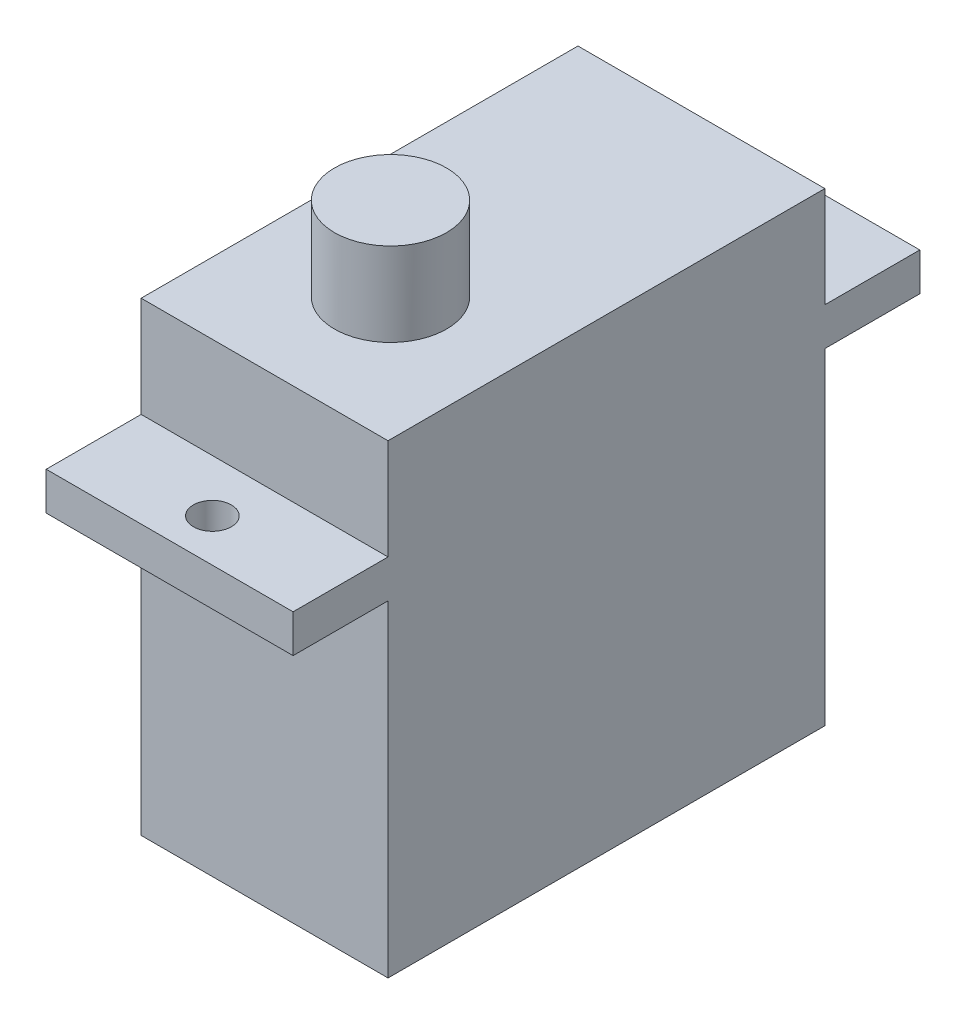
ISO-10303-21;
HEADER;
FILE_DESCRIPTION(('STEP AP214'),'2;1');
FILE_NAME('part.step','',(''),(''),'','','');
FILE_SCHEMA(('AUTOMOTIVE_DESIGN { 1 0 10303 214 1 1 1 1 }'));
ENDSEC;
DATA;
#1=APPLICATION_CONTEXT('core data for automotive mechanical design processes');
#2=APPLICATION_PROTOCOL_DEFINITION('international standard','automotive_design',2000,#1);
#3=PRODUCT_CONTEXT('',#1,'mechanical');
#4=PRODUCT('Part','Part','',(#3));
#5=PRODUCT_RELATED_PRODUCT_CATEGORY('part','',(#4));
#6=PRODUCT_DEFINITION_FORMATION('','',#4);
#7=PRODUCT_DEFINITION_CONTEXT('part definition',#1,'design');
#8=PRODUCT_DEFINITION('design','',#6,#7);
#9=PRODUCT_DEFINITION_SHAPE('','',#8);
#10=(LENGTH_UNIT() NAMED_UNIT(*) SI_UNIT(.MILLI.,.METRE.));
#11=(NAMED_UNIT(*) PLANE_ANGLE_UNIT() SI_UNIT($,.RADIAN.));
#12=(NAMED_UNIT(*) SI_UNIT($,.STERADIAN.) SOLID_ANGLE_UNIT());
#13=UNCERTAINTY_MEASURE_WITH_UNIT(LENGTH_MEASURE(1.E-05),#10,'distance_accuracy_value','');
#14=(GEOMETRIC_REPRESENTATION_CONTEXT(3) GLOBAL_UNCERTAINTY_ASSIGNED_CONTEXT((#13)) GLOBAL_UNIT_ASSIGNED_CONTEXT((#10,
#11,#12)) REPRESENTATION_CONTEXT('',''));
#15=CARTESIAN_POINT('',(0.,0.,0.));
#16=DIRECTION('',(0.,0.,1.));
#17=DIRECTION('',(1.,0.,0.));
#18=AXIS2_PLACEMENT_3D('',#15,#16,#17);
#19=CARTESIAN_POINT('',(13.,8.6,-11.5));
#20=DIRECTION('',(0.,0.,1.));
#21=DIRECTION('',(0.,-1.,0.));
#22=AXIS2_PLACEMENT_3D('',#19,#20,#21);
#23=PLANE('',#22);
#24=DIRECTION('',(0.,1.,0.));
#25=VECTOR('',#24,1.);
#26=CARTESIAN_POINT('',(0.,8.6,-11.5));
#27=LINE('',#26,#25);
#28=CARTESIAN_POINT('',(0.,-8.6,-11.5));
#29=VERTEX_POINT('',#28);
#30=CARTESIAN_POINT('',(0.,8.6,-11.5));
#31=VERTEX_POINT('',#30);
#32=EDGE_CURVE('E165',#29,#31,#27,.T.);
#33=ORIENTED_EDGE('',*,*,#32,.T.);
#34=DIRECTION('',(-1.,0.,0.));
#35=VECTOR('',#34,1.);
#36=CARTESIAN_POINT('',(13.,8.6,-11.5));
#37=LINE('',#36,#35);
#38=CARTESIAN_POINT('',(13.,8.6,-11.5));
#39=VERTEX_POINT('',#38);
#40=EDGE_CURVE('E48',#39,#31,#37,.T.);
#41=ORIENTED_EDGE('',*,*,#40,.F.);
#42=DIRECTION('',(0.,1.,0.));
#43=VECTOR('',#42,1.);
#44=CARTESIAN_POINT('',(13.,8.6,-11.5));
#45=LINE('',#44,#43);
#46=CARTESIAN_POINT('',(13.,-8.6,-11.5));
#47=VERTEX_POINT('',#46);
#48=EDGE_CURVE('E200',#47,#39,#45,.T.);
#49=ORIENTED_EDGE('',*,*,#48,.F.);
#50=DIRECTION('',(-1.,0.,0.));
#51=VECTOR('',#50,1.);
#52=CARTESIAN_POINT('',(13.,-8.6,-11.5));
#53=LINE('',#52,#51);
#54=EDGE_CURVE('E161',#47,#29,#53,.T.);
#55=ORIENTED_EDGE('',*,*,#54,.T.);
#56=EDGE_LOOP('',(#33,#41,#49,#55));
#57=FACE_BOUND('',#56,.T.);
#58=ADVANCED_FACE('F39',(#57),#23,.F.);
#59=CARTESIAN_POINT('',(13.,8.6,-11.5));
#60=DIRECTION('',(0.,1.,0.));
#61=DIRECTION('',(0.,0.,1.));
#62=AXIS2_PLACEMENT_3D('',#59,#60,#61);
#63=PLANE('',#62);
#64=CARTESIAN_POINT('',(6.5,8.6,-14.25));
#65=DIRECTION('',(0.,1.,0.));
#66=DIRECTION('',(0.,0.,1.));
#67=AXIS2_PLACEMENT_3D('',#64,#65,#66);
#68=CIRCLE('',#67,1.);
#69=CARTESIAN_POINT('',(6.5,8.6,-13.25));
#70=VERTEX_POINT('',#69);
#71=EDGE_CURVE('E170',#70,#70,#68,.T.);
#72=ORIENTED_EDGE('',*,*,#71,.T.);
#73=EDGE_LOOP('',(#72));
#74=FACE_BOUND('',#73,.T.);
#75=DIRECTION('',(0.,0.,-1.));
#76=VECTOR('',#75,1.);
#77=CARTESIAN_POINT('',(0.,8.6,-11.5));
#78=LINE('',#77,#76);
#79=CARTESIAN_POINT('',(0.,8.6,-16.5));
#80=VERTEX_POINT('',#79);
#81=EDGE_CURVE('E169',#31,#80,#78,.T.);
#82=ORIENTED_EDGE('',*,*,#81,.T.);
#83=DIRECTION('',(-1.,0.,0.));
#84=VECTOR('',#83,1.);
#85=CARTESIAN_POINT('',(13.,8.6,-16.5));
#86=LINE('',#85,#84);
#87=CARTESIAN_POINT('',(13.,8.6,-16.5));
#88=VERTEX_POINT('',#87);
#89=EDGE_CURVE('E231',#88,#80,#86,.T.);
#90=ORIENTED_EDGE('',*,*,#89,.F.);
#91=DIRECTION('',(0.,0.,-1.));
#92=VECTOR('',#91,1.);
#93=CARTESIAN_POINT('',(13.,8.6,-11.5));
#94=LINE('',#93,#92);
#95=EDGE_CURVE('E112',#39,#88,#94,.T.);
#96=ORIENTED_EDGE('',*,*,#95,.F.);
#97=ORIENTED_EDGE('',*,*,#40,.T.);
#98=EDGE_LOOP('',(#82,#90,#96,#97));
#99=FACE_BOUND('',#98,.T.);
#100=ADVANCED_FACE('F307',(#74,#99),#63,.F.);
#101=CARTESIAN_POINT('',(13.,10.6,-16.5));
#102=DIRECTION('',(0.,0.,1.));
#103=DIRECTION('',(1.,0.,0.));
#104=AXIS2_PLACEMENT_3D('',#101,#102,#103);
#105=PLANE('',#104);
#106=DIRECTION('',(0.,1.,0.));
#107=VECTOR('',#106,1.);
#108=CARTESIAN_POINT('',(0.,10.6,-16.5));
#109=LINE('',#108,#107);
#110=CARTESIAN_POINT('',(0.,10.6,-16.5));
#111=VERTEX_POINT('',#110);
#112=EDGE_CURVE('E173',#80,#111,#109,.T.);
#113=ORIENTED_EDGE('',*,*,#112,.T.);
#114=DIRECTION('',(-1.,0.,0.));
#115=VECTOR('',#114,1.);
#116=CARTESIAN_POINT('',(13.,10.6,-16.5));
#117=LINE('',#116,#115);
#118=CARTESIAN_POINT('',(13.,10.6,-16.5));
#119=VERTEX_POINT('',#118);
#120=EDGE_CURVE('E227',#119,#111,#117,.T.);
#121=ORIENTED_EDGE('',*,*,#120,.F.);
#122=DIRECTION('',(0.,1.,0.));
#123=VECTOR('',#122,1.);
#124=CARTESIAN_POINT('',(13.,10.6,-16.5));
#125=LINE('',#124,#123);
#126=EDGE_CURVE('E261',#88,#119,#125,.T.);
#127=ORIENTED_EDGE('',*,*,#126,.F.);
#128=ORIENTED_EDGE('',*,*,#89,.T.);
#129=EDGE_LOOP('',(#113,#121,#127,#128));
#130=FACE_BOUND('',#129,.T.);
#131=ADVANCED_FACE('F311',(#130),#105,.F.);
#132=CARTESIAN_POINT('',(13.,10.6,-11.5));
#133=DIRECTION('',(0.,-1.,0.));
#134=DIRECTION('',(0.,0.,-1.));
#135=AXIS2_PLACEMENT_3D('',#132,#133,#134);
#136=PLANE('',#135);
#137=CARTESIAN_POINT('',(6.5,10.6,-14.25));
#138=DIRECTION('',(0.,1.,0.));
#139=DIRECTION('',(0.,0.,1.));
#140=AXIS2_PLACEMENT_3D('',#137,#138,#139);
#141=CIRCLE('',#140,1.);
#142=CARTESIAN_POINT('',(6.5,10.6,-13.25));
#143=VERTEX_POINT('',#142);
#144=EDGE_CURVE('E239',#143,#143,#141,.T.);
#145=ORIENTED_EDGE('',*,*,#144,.F.);
#146=EDGE_LOOP('',(#145));
#147=FACE_BOUND('',#146,.T.);
#148=DIRECTION('',(0.,0.,1.));
#149=VECTOR('',#148,1.);
#150=CARTESIAN_POINT('',(0.,10.6,-11.5));
#151=LINE('',#150,#149);
#152=CARTESIAN_POINT('',(0.,10.6,-11.5));
#153=VERTEX_POINT('',#152);
#154=EDGE_CURVE('E176',#111,#153,#151,.T.);
#155=ORIENTED_EDGE('',*,*,#154,.T.);
#156=DIRECTION('',(-1.,0.,0.));
#157=VECTOR('',#156,1.);
#158=CARTESIAN_POINT('',(13.,10.6,-11.5));
#159=LINE('',#158,#157);
#160=CARTESIAN_POINT('',(13.,10.6,-11.5));
#161=VERTEX_POINT('',#160);
#162=EDGE_CURVE('E223',#161,#153,#159,.T.);
#163=ORIENTED_EDGE('',*,*,#162,.F.);
#164=DIRECTION('',(0.,0.,1.));
#165=VECTOR('',#164,1.);
#166=CARTESIAN_POINT('',(13.,10.6,-11.5));
#167=LINE('',#166,#165);
#168=EDGE_CURVE('E264',#119,#161,#167,.T.);
#169=ORIENTED_EDGE('',*,*,#168,.F.);
#170=ORIENTED_EDGE('',*,*,#120,.T.);
#171=EDGE_LOOP('',(#155,#163,#169,#170));
#172=FACE_BOUND('',#171,.T.);
#173=ADVANCED_FACE('F316',(#147,#172),#136,.F.);
#174=CARTESIAN_POINT('',(13.,15.9,-11.5));
#175=DIRECTION('',(0.,0.,1.));
#176=DIRECTION('',(0.,-1.,0.));
#177=AXIS2_PLACEMENT_3D('',#174,#175,#176);
#178=PLANE('',#177);
#179=DIRECTION('',(0.,1.,0.));
#180=VECTOR('',#179,1.);
#181=CARTESIAN_POINT('',(0.,15.9,-11.5));
#182=LINE('',#181,#180);
#183=CARTESIAN_POINT('',(0.,15.9,-11.5));
#184=VERTEX_POINT('',#183);
#185=EDGE_CURVE('E179',#153,#184,#182,.T.);
#186=ORIENTED_EDGE('',*,*,#185,.T.);
#187=DIRECTION('',(-1.,0.,0.));
#188=VECTOR('',#187,1.);
#189=CARTESIAN_POINT('',(13.,15.9,-11.5));
#190=LINE('',#189,#188);
#191=CARTESIAN_POINT('',(13.,15.9,-11.5));
#192=VERTEX_POINT('',#191);
#193=EDGE_CURVE('E219',#192,#184,#190,.T.);
#194=ORIENTED_EDGE('',*,*,#193,.F.);
#195=DIRECTION('',(0.,1.,0.));
#196=VECTOR('',#195,1.);
#197=CARTESIAN_POINT('',(13.,15.9,-11.5));
#198=LINE('',#197,#196);
#199=EDGE_CURVE('E267',#161,#192,#198,.T.);
#200=ORIENTED_EDGE('',*,*,#199,.F.);
#201=ORIENTED_EDGE('',*,*,#162,.T.);
#202=EDGE_LOOP('',(#186,#194,#200,#201));
#203=FACE_BOUND('',#202,.T.);
#204=ADVANCED_FACE('F322',(#203),#178,.F.);
#205=CARTESIAN_POINT('',(13.,15.9,11.5));
#206=DIRECTION('',(0.,-1.,0.));
#207=DIRECTION('',(0.,0.,-1.));
#208=AXIS2_PLACEMENT_3D('',#205,#206,#207);
#209=PLANE('',#208);
#210=CARTESIAN_POINT('',(6.5,15.9,4.87));
#211=DIRECTION('',(0.,-1.,0.));
#212=DIRECTION('',(0.,0.,-1.));
#213=AXIS2_PLACEMENT_3D('',#210,#211,#212);
#214=CIRCLE('',#213,2.95);
#215=CARTESIAN_POINT('',(6.5,15.9,1.92));
#216=VERTEX_POINT('',#215);
#217=EDGE_CURVE('E11',#216,#216,#214,.F.);
#218=ORIENTED_EDGE('',*,*,#217,.F.);
#219=EDGE_LOOP('',(#218));
#220=FACE_BOUND('',#219,.T.);
#221=DIRECTION('',(0.,0.,1.));
#222=VECTOR('',#221,1.);
#223=CARTESIAN_POINT('',(0.,15.9,11.5));
#224=LINE('',#223,#222);
#225=CARTESIAN_POINT('',(0.,15.9,11.5));
#226=VERTEX_POINT('',#225);
#227=EDGE_CURVE('E182',#184,#226,#224,.T.);
#228=ORIENTED_EDGE('',*,*,#227,.T.);
#229=DIRECTION('',(-1.,0.,0.));
#230=VECTOR('',#229,1.);
#231=CARTESIAN_POINT('',(13.,15.9,11.5));
#232=LINE('',#231,#230);
#233=CARTESIAN_POINT('',(13.,15.9,11.5));
#234=VERTEX_POINT('',#233);
#235=EDGE_CURVE('E215',#234,#226,#232,.T.);
#236=ORIENTED_EDGE('',*,*,#235,.F.);
#237=DIRECTION('',(0.,0.,1.));
#238=VECTOR('',#237,1.);
#239=CARTESIAN_POINT('',(13.,15.9,11.5));
#240=LINE('',#239,#238);
#241=EDGE_CURVE('E270',#192,#234,#240,.T.);
#242=ORIENTED_EDGE('',*,*,#241,.F.);
#243=ORIENTED_EDGE('',*,*,#193,.T.);
#244=EDGE_LOOP('',(#228,#236,#242,#243));
#245=FACE_BOUND('',#244,.T.);
#246=ADVANCED_FACE('F326',(#220,#245),#209,.F.);
#247=CARTESIAN_POINT('',(13.,15.9,11.5));
#248=DIRECTION('',(0.,0.,-1.));
#249=DIRECTION('',(0.,1.,0.));
#250=AXIS2_PLACEMENT_3D('',#247,#248,#249);
#251=PLANE('',#250);
#252=DIRECTION('',(0.,-1.,0.));
#253=VECTOR('',#252,1.);
#254=CARTESIAN_POINT('',(0.,15.9,11.5));
#255=LINE('',#254,#253);
#256=CARTESIAN_POINT('',(0.,10.6,11.5));
#257=VERTEX_POINT('',#256);
#258=EDGE_CURVE('E185',#226,#257,#255,.T.);
#259=ORIENTED_EDGE('',*,*,#258,.T.);
#260=DIRECTION('',(-1.,0.,0.));
#261=VECTOR('',#260,1.);
#262=CARTESIAN_POINT('',(13.,10.6,11.5));
#263=LINE('',#262,#261);
#264=CARTESIAN_POINT('',(13.,10.6,11.5));
#265=VERTEX_POINT('',#264);
#266=EDGE_CURVE('E211',#265,#257,#263,.T.);
#267=ORIENTED_EDGE('',*,*,#266,.F.);
#268=DIRECTION('',(0.,-1.,0.));
#269=VECTOR('',#268,1.);
#270=CARTESIAN_POINT('',(13.,15.9,11.5));
#271=LINE('',#270,#269);
#272=EDGE_CURVE('E273',#234,#265,#271,.T.);
#273=ORIENTED_EDGE('',*,*,#272,.F.);
#274=ORIENTED_EDGE('',*,*,#235,.T.);
#275=EDGE_LOOP('',(#259,#267,#273,#274));
#276=FACE_BOUND('',#275,.T.);
#277=ADVANCED_FACE('F330',(#276),#251,.F.);
#278=CARTESIAN_POINT('',(13.,10.6,16.5));
#279=DIRECTION('',(0.,-1.,0.));
#280=DIRECTION('',(0.,0.,-1.));
#281=AXIS2_PLACEMENT_3D('',#278,#279,#280);
#282=PLANE('',#281);
#283=CARTESIAN_POINT('',(6.5,10.6,14.25));
#284=DIRECTION('',(0.,1.,0.));
#285=DIRECTION('',(0.,0.,1.));
#286=AXIS2_PLACEMENT_3D('',#283,#284,#285);
#287=CIRCLE('',#286,1.);
#288=CARTESIAN_POINT('',(6.5,10.6,15.25));
#289=VERTEX_POINT('',#288);
#290=EDGE_CURVE('E247',#289,#289,#287,.T.);
#291=ORIENTED_EDGE('',*,*,#290,.F.);
#292=EDGE_LOOP('',(#291));
#293=FACE_BOUND('',#292,.T.);
#294=DIRECTION('',(0.,0.,1.));
#295=VECTOR('',#294,1.);
#296=CARTESIAN_POINT('',(0.,10.6,16.5));
#297=LINE('',#296,#295);
#298=CARTESIAN_POINT('',(0.,10.6,16.5));
#299=VERTEX_POINT('',#298);
#300=EDGE_CURVE('E188',#257,#299,#297,.T.);
#301=ORIENTED_EDGE('',*,*,#300,.T.);
#302=DIRECTION('',(-1.,0.,0.));
#303=VECTOR('',#302,1.);
#304=CARTESIAN_POINT('',(13.,10.6,16.5));
#305=LINE('',#304,#303);
#306=CARTESIAN_POINT('',(13.,10.6,16.5));
#307=VERTEX_POINT('',#306);
#308=EDGE_CURVE('E207',#307,#299,#305,.T.);
#309=ORIENTED_EDGE('',*,*,#308,.F.);
#310=DIRECTION('',(0.,0.,1.));
#311=VECTOR('',#310,1.);
#312=CARTESIAN_POINT('',(13.,10.6,16.5));
#313=LINE('',#312,#311);
#314=EDGE_CURVE('E276',#265,#307,#313,.T.);
#315=ORIENTED_EDGE('',*,*,#314,.F.);
#316=ORIENTED_EDGE('',*,*,#266,.T.);
#317=EDGE_LOOP('',(#301,#309,#315,#316));
#318=FACE_BOUND('',#317,.T.);
#319=ADVANCED_FACE('F284',(#293,#318),#282,.F.);
#320=CARTESIAN_POINT('',(13.,10.6,16.5));
#321=DIRECTION('',(0.,0.,-1.));
#322=DIRECTION('',(-1.,0.,0.));
#323=AXIS2_PLACEMENT_3D('',#320,#321,#322);
#324=PLANE('',#323);
#325=DIRECTION('',(0.,-1.,0.));
#326=VECTOR('',#325,1.);
#327=CARTESIAN_POINT('',(0.,10.6,16.5));
#328=LINE('',#327,#326);
#329=CARTESIAN_POINT('',(0.,8.6,16.5));
#330=VERTEX_POINT('',#329);
#331=EDGE_CURVE('E191',#299,#330,#328,.T.);
#332=ORIENTED_EDGE('',*,*,#331,.T.);
#333=DIRECTION('',(-1.,0.,0.));
#334=VECTOR('',#333,1.);
#335=CARTESIAN_POINT('',(13.,8.6,16.5));
#336=LINE('',#335,#334);
#337=CARTESIAN_POINT('',(13.,8.6,16.5));
#338=VERTEX_POINT('',#337);
#339=EDGE_CURVE('E154',#338,#330,#336,.T.);
#340=ORIENTED_EDGE('',*,*,#339,.F.);
#341=DIRECTION('',(0.,-1.,0.));
#342=VECTOR('',#341,1.);
#343=CARTESIAN_POINT('',(13.,10.6,16.5));
#344=LINE('',#343,#342);
#345=EDGE_CURVE('E143',#307,#338,#344,.T.);
#346=ORIENTED_EDGE('',*,*,#345,.F.);
#347=ORIENTED_EDGE('',*,*,#308,.T.);
#348=EDGE_LOOP('',(#332,#340,#346,#347));
#349=FACE_BOUND('',#348,.T.);
#350=ADVANCED_FACE('F288',(#349),#324,.F.);
#351=CARTESIAN_POINT('',(13.,8.6,16.5));
#352=DIRECTION('',(0.,1.,0.));
#353=DIRECTION('',(0.,0.,1.));
#354=AXIS2_PLACEMENT_3D('',#351,#352,#353);
#355=PLANE('',#354);
#356=CARTESIAN_POINT('',(6.5,8.6,14.25));
#357=DIRECTION('',(0.,1.,0.));
#358=DIRECTION('',(0.,0.,1.));
#359=AXIS2_PLACEMENT_3D('',#356,#357,#358);
#360=CIRCLE('',#359,1.);
#361=CARTESIAN_POINT('',(6.5,8.6,15.25));
#362=VERTEX_POINT('',#361);
#363=EDGE_CURVE('E236',#362,#362,#360,.T.);
#364=ORIENTED_EDGE('',*,*,#363,.T.);
#365=EDGE_LOOP('',(#364));
#366=FACE_BOUND('',#365,.T.);
#367=DIRECTION('',(0.,0.,-1.));
#368=VECTOR('',#367,1.);
#369=CARTESIAN_POINT('',(0.,8.6,16.5));
#370=LINE('',#369,#368);
#371=CARTESIAN_POINT('',(0.,8.6,11.5));
#372=VERTEX_POINT('',#371);
#373=EDGE_CURVE('E152',#330,#372,#370,.T.);
#374=ORIENTED_EDGE('',*,*,#373,.T.);
#375=DIRECTION('',(-1.,0.,0.));
#376=VECTOR('',#375,1.);
#377=CARTESIAN_POINT('',(13.,8.6,11.5));
#378=LINE('',#377,#376);
#379=CARTESIAN_POINT('',(13.,8.6,11.5));
#380=VERTEX_POINT('',#379);
#381=EDGE_CURVE('E149',#380,#372,#378,.T.);
#382=ORIENTED_EDGE('',*,*,#381,.F.);
#383=DIRECTION('',(0.,0.,-1.));
#384=VECTOR('',#383,1.);
#385=CARTESIAN_POINT('',(13.,8.6,16.5));
#386=LINE('',#385,#384);
#387=EDGE_CURVE('E137',#338,#380,#386,.T.);
#388=ORIENTED_EDGE('',*,*,#387,.F.);
#389=ORIENTED_EDGE('',*,*,#339,.T.);
#390=EDGE_LOOP('',(#374,#382,#388,#389));
#391=FACE_BOUND('',#390,.T.);
#392=ADVANCED_FACE('F150',(#366,#391),#355,.F.);
#393=CARTESIAN_POINT('',(13.,8.6,11.5));
#394=DIRECTION('',(0.,0.,-1.));
#395=DIRECTION('',(0.,1.,0.));
#396=AXIS2_PLACEMENT_3D('',#393,#394,#395);
#397=PLANE('',#396);
#398=DIRECTION('',(0.,-1.,0.));
#399=VECTOR('',#398,1.);
#400=CARTESIAN_POINT('',(0.,8.6,11.5));
#401=LINE('',#400,#399);
#402=CARTESIAN_POINT('',(0.,-8.6,11.5));
#403=VERTEX_POINT('',#402);
#404=EDGE_CURVE('E97',#372,#403,#401,.T.);
#405=ORIENTED_EDGE('',*,*,#404,.T.);
#406=DIRECTION('',(-1.,0.,0.));
#407=VECTOR('',#406,1.);
#408=CARTESIAN_POINT('',(13.,-8.6,11.5));
#409=LINE('',#408,#407);
#410=CARTESIAN_POINT('',(13.,-8.6,11.5));
#411=VERTEX_POINT('',#410);
#412=EDGE_CURVE('E155',#411,#403,#409,.T.);
#413=ORIENTED_EDGE('',*,*,#412,.F.);
#414=DIRECTION('',(0.,-1.,0.));
#415=VECTOR('',#414,1.);
#416=CARTESIAN_POINT('',(13.,8.6,11.5));
#417=LINE('',#416,#415);
#418=EDGE_CURVE('E141',#380,#411,#417,.T.);
#419=ORIENTED_EDGE('',*,*,#418,.F.);
#420=ORIENTED_EDGE('',*,*,#381,.T.);
#421=EDGE_LOOP('',(#405,#413,#419,#420));
#422=FACE_BOUND('',#421,.T.);
#423=ADVANCED_FACE('F157',(#422),#397,.F.);
#424=CARTESIAN_POINT('',(13.,-8.6,11.5));
#425=DIRECTION('',(0.,1.,0.));
#426=DIRECTION('',(0.,0.,1.));
#427=AXIS2_PLACEMENT_3D('',#424,#425,#426);
#428=PLANE('',#427);
#429=DIRECTION('',(0.,0.,-1.));
#430=VECTOR('',#429,1.);
#431=CARTESIAN_POINT('',(0.,-8.6,11.5));
#432=LINE('',#431,#430);
#433=EDGE_CURVE('E103',#403,#29,#432,.T.);
#434=ORIENTED_EDGE('',*,*,#433,.T.);
#435=ORIENTED_EDGE('',*,*,#54,.F.);
#436=DIRECTION('',(0.,0.,-1.));
#437=VECTOR('',#436,1.);
#438=CARTESIAN_POINT('',(13.,-8.6,11.5));
#439=LINE('',#438,#437);
#440=EDGE_CURVE('E56',#411,#47,#439,.T.);
#441=ORIENTED_EDGE('',*,*,#440,.F.);
#442=ORIENTED_EDGE('',*,*,#412,.T.);
#443=EDGE_LOOP('',(#434,#435,#441,#442));
#444=FACE_BOUND('',#443,.T.);
#445=ADVANCED_FACE('F296',(#444),#428,.F.);
#446=CARTESIAN_POINT('',(13.,0.,0.));
#447=DIRECTION('',(1.,0.,0.));
#448=DIRECTION('',(0.,0.,-1.));
#449=AXIS2_PLACEMENT_3D('',#446,#447,#448);
#450=PLANE('',#449);
#451=ORIENTED_EDGE('',*,*,#48,.T.);
#452=ORIENTED_EDGE('',*,*,#95,.T.);
#453=ORIENTED_EDGE('',*,*,#126,.T.);
#454=ORIENTED_EDGE('',*,*,#168,.T.);
#455=ORIENTED_EDGE('',*,*,#199,.T.);
#456=ORIENTED_EDGE('',*,*,#241,.T.);
#457=ORIENTED_EDGE('',*,*,#272,.T.);
#458=ORIENTED_EDGE('',*,*,#314,.T.);
#459=ORIENTED_EDGE('',*,*,#345,.T.);
#460=ORIENTED_EDGE('',*,*,#387,.T.);
#461=ORIENTED_EDGE('',*,*,#418,.T.);
#462=ORIENTED_EDGE('',*,*,#440,.T.);
#463=EDGE_LOOP('',(#451,#452,#453,#454,#455,#456,#457,#458,#459,#460,#461,#462));
#464=FACE_BOUND('',#463,.T.);
#465=ADVANCED_FACE('F139',(#464),#450,.T.);
#466=CARTESIAN_POINT('',(0.,0.,0.));
#467=DIRECTION('',(1.,0.,0.));
#468=DIRECTION('',(0.,0.,-1.));
#469=AXIS2_PLACEMENT_3D('',#466,#467,#468);
#470=PLANE('',#469);
#471=ORIENTED_EDGE('',*,*,#32,.F.);
#472=ORIENTED_EDGE('',*,*,#433,.F.);
#473=ORIENTED_EDGE('',*,*,#404,.F.);
#474=ORIENTED_EDGE('',*,*,#373,.F.);
#475=ORIENTED_EDGE('',*,*,#331,.F.);
#476=ORIENTED_EDGE('',*,*,#300,.F.);
#477=ORIENTED_EDGE('',*,*,#258,.F.);
#478=ORIENTED_EDGE('',*,*,#227,.F.);
#479=ORIENTED_EDGE('',*,*,#185,.F.);
#480=ORIENTED_EDGE('',*,*,#154,.F.);
#481=ORIENTED_EDGE('',*,*,#112,.F.);
#482=ORIENTED_EDGE('',*,*,#81,.F.);
#483=EDGE_LOOP('',(#471,#472,#473,#474,#475,#476,#477,#478,#479,#480,#481,#482));
#484=FACE_BOUND('',#483,.T.);
#485=ADVANCED_FACE('F291',(#484),#470,.F.);
#486=CARTESIAN_POINT('',(6.5,-8.6,14.25));
#487=DIRECTION('',(0.,1.,0.));
#488=DIRECTION('',(0.,0.,1.));
#489=AXIS2_PLACEMENT_3D('',#486,#487,#488);
#490=CYLINDRICAL_SURFACE('',#489,1.);
#491=ORIENTED_EDGE('',*,*,#290,.T.);
#492=EDGE_LOOP('',(#491));
#493=FACE_BOUND('',#492,.T.);
#494=ORIENTED_EDGE('',*,*,#363,.F.);
#495=EDGE_LOOP('',(#494));
#496=FACE_BOUND('',#495,.T.);
#497=ADVANCED_FACE('F372',(#493,#496),#490,.F.);
#498=CARTESIAN_POINT('',(6.5,-8.6,-14.25));
#499=DIRECTION('',(0.,1.,0.));
#500=DIRECTION('',(0.,0.,1.));
#501=AXIS2_PLACEMENT_3D('',#498,#499,#500);
#502=CYLINDRICAL_SURFACE('',#501,1.);
#503=ORIENTED_EDGE('',*,*,#144,.T.);
#504=EDGE_LOOP('',(#503));
#505=FACE_BOUND('',#504,.T.);
#506=ORIENTED_EDGE('',*,*,#71,.F.);
#507=EDGE_LOOP('',(#506));
#508=FACE_BOUND('',#507,.T.);
#509=ADVANCED_FACE('F422',(#505,#508),#502,.F.);
#510=CARTESIAN_POINT('',(6.5,20.3,4.87));
#511=DIRECTION('',(0.,-1.,0.));
#512=DIRECTION('',(0.,0.,-1.));
#513=AXIS2_PLACEMENT_3D('',#510,#511,#512);
#514=CYLINDRICAL_SURFACE('',#513,2.95);
#515=CARTESIAN_POINT('',(6.5,20.3,4.87));
#516=DIRECTION('',(0.,1.,0.));
#517=DIRECTION('',(0.,0.,1.));
#518=AXIS2_PLACEMENT_3D('',#515,#516,#517);
#519=CIRCLE('',#518,2.95);
#520=CARTESIAN_POINT('',(6.5,20.3,7.82));
#521=VERTEX_POINT('',#520);
#522=EDGE_CURVE('E253',#521,#521,#519,.T.);
#523=ORIENTED_EDGE('',*,*,#522,.F.);
#524=EDGE_LOOP('',(#523));
#525=FACE_BOUND('',#524,.T.);
#526=ORIENTED_EDGE('',*,*,#217,.T.);
#527=EDGE_LOOP('',(#526));
#528=FACE_BOUND('',#527,.T.);
#529=ADVANCED_FACE('F426',(#525,#528),#514,.T.);
#530=CARTESIAN_POINT('',(6.5,20.3,4.87));
#531=DIRECTION('',(0.,1.,0.));
#532=DIRECTION('',(0.,0.,1.));
#533=AXIS2_PLACEMENT_3D('',#530,#531,#532);
#534=PLANE('',#533);
#535=ORIENTED_EDGE('',*,*,#522,.T.);
#536=EDGE_LOOP('',(#535));
#537=FACE_BOUND('',#536,.T.);
#538=ADVANCED_FACE('F431',(#537),#534,.T.);
#539=CLOSED_SHELL('',(#58,#100,#131,#173,#204,#246,#277,#319,#350,#392,#423,#445,#465,#485,#497,
#509,#529,#538));
#540=MANIFOLD_SOLID_BREP('B2',#539);
#541=ADVANCED_BREP_SHAPE_REPRESENTATION('',(#18,#540),#14);
#542=SHAPE_DEFINITION_REPRESENTATION(#9,#541);
ENDSEC;
END-ISO-10303-21;
